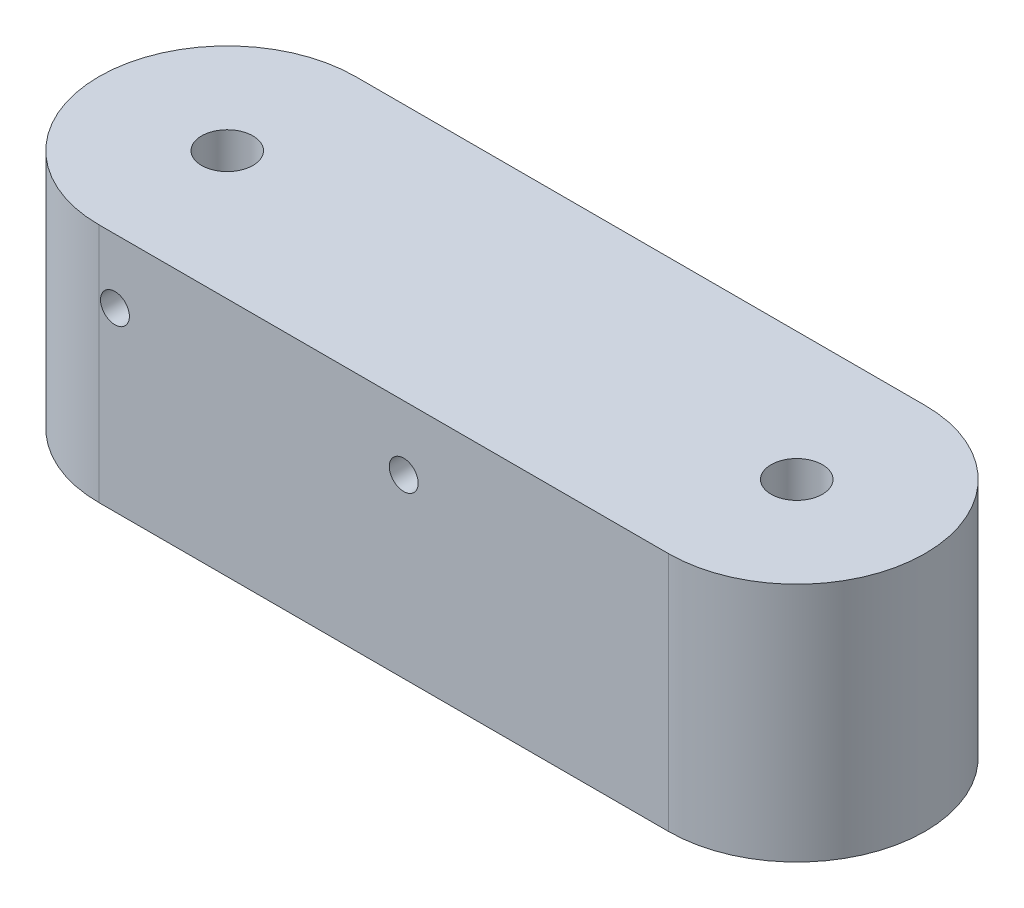
ISO-10303-21;
HEADER;
FILE_DESCRIPTION(('STEP AP214'),'2;1');
FILE_NAME('part.step','',(''),(''),'','','');
FILE_SCHEMA(('AUTOMOTIVE_DESIGN { 1 0 10303 214 1 1 1 1 }'));
ENDSEC;
DATA;
#1=APPLICATION_CONTEXT('core data for automotive mechanical design processes');
#2=APPLICATION_PROTOCOL_DEFINITION('international standard','automotive_design',2000,#1);
#3=PRODUCT_CONTEXT('',#1,'mechanical');
#4=PRODUCT('Part','Part','',(#3));
#5=PRODUCT_RELATED_PRODUCT_CATEGORY('part','',(#4));
#6=PRODUCT_DEFINITION_FORMATION('','',#4);
#7=PRODUCT_DEFINITION_CONTEXT('part definition',#1,'design');
#8=PRODUCT_DEFINITION('design','',#6,#7);
#9=PRODUCT_DEFINITION_SHAPE('','',#8);
#10=(LENGTH_UNIT() NAMED_UNIT(*) SI_UNIT(.MILLI.,.METRE.));
#11=(NAMED_UNIT(*) PLANE_ANGLE_UNIT() SI_UNIT($,.RADIAN.));
#12=(NAMED_UNIT(*) SI_UNIT($,.STERADIAN.) SOLID_ANGLE_UNIT());
#13=UNCERTAINTY_MEASURE_WITH_UNIT(LENGTH_MEASURE(1.E-05),#10,'distance_accuracy_value','');
#14=(GEOMETRIC_REPRESENTATION_CONTEXT(3) GLOBAL_UNCERTAINTY_ASSIGNED_CONTEXT((#13)) GLOBAL_UNIT_ASSIGNED_CONTEXT((#10,
#11,#12)) REPRESENTATION_CONTEXT('',''));
#15=CARTESIAN_POINT('',(0.,0.,0.));
#16=DIRECTION('',(0.,0.,1.));
#17=DIRECTION('',(1.,0.,0.));
#18=AXIS2_PLACEMENT_3D('',#15,#16,#17);
#19=CARTESIAN_POINT('',(0.,15.,8.));
#20=DIRECTION('',(0.,0.,-1.));
#21=DIRECTION('',(-1.,0.,0.));
#22=AXIS2_PLACEMENT_3D('',#19,#20,#21);
#23=PLANE('',#22);
#24=CARTESIAN_POINT('',(1.,11.,8.));
#25=DIRECTION('',(0.,0.,1.));
#26=DIRECTION('',(1.,0.,0.));
#27=AXIS2_PLACEMENT_3D('',#24,#25,#26);
#28=CIRCLE('',#27,0.9);
#29=CARTESIAN_POINT('',(1.9,11.,8.));
#30=VERTEX_POINT('',#29);
#31=EDGE_CURVE('E178',#30,#30,#28,.T.);
#32=ORIENTED_EDGE('',*,*,#31,.F.);
#33=EDGE_LOOP('',(#32));
#34=FACE_BOUND('',#33,.T.);
#35=CARTESIAN_POINT('',(19.,11.,8.));
#36=DIRECTION('',(0.,0.,1.));
#37=DIRECTION('',(1.,0.,0.));
#38=AXIS2_PLACEMENT_3D('',#35,#36,#37);
#39=CIRCLE('',#38,0.9);
#40=CARTESIAN_POINT('',(19.9,11.,8.));
#41=VERTEX_POINT('',#40);
#42=EDGE_CURVE('E173',#41,#41,#39,.T.);
#43=ORIENTED_EDGE('',*,*,#42,.F.);
#44=EDGE_LOOP('',(#43));
#45=FACE_BOUND('',#44,.T.);
#46=DIRECTION('',(1.,0.,0.));
#47=VECTOR('',#46,1.);
#48=CARTESIAN_POINT('',(0.,0.,8.));
#49=LINE('',#48,#47);
#50=CARTESIAN_POINT('',(0.,0.,8.));
#51=VERTEX_POINT('',#50);
#52=CARTESIAN_POINT('',(35.5,0.,8.));
#53=VERTEX_POINT('',#52);
#54=EDGE_CURVE('E111',#51,#53,#49,.T.);
#55=ORIENTED_EDGE('',*,*,#54,.T.);
#56=DIRECTION('',(0.,-1.,0.));
#57=VECTOR('',#56,1.);
#58=CARTESIAN_POINT('',(35.5,15.,8.));
#59=LINE('',#58,#57);
#60=CARTESIAN_POINT('',(35.5,15.,8.));
#61=VERTEX_POINT('',#60);
#62=EDGE_CURVE('E11',#61,#53,#59,.T.);
#63=ORIENTED_EDGE('',*,*,#62,.F.);
#64=DIRECTION('',(1.,0.,0.));
#65=VECTOR('',#64,1.);
#66=CARTESIAN_POINT('',(0.,15.,8.));
#67=LINE('',#66,#65);
#68=CARTESIAN_POINT('',(0.,15.,8.));
#69=VERTEX_POINT('',#68);
#70=EDGE_CURVE('E88',#69,#61,#67,.T.);
#71=ORIENTED_EDGE('',*,*,#70,.F.);
#72=DIRECTION('',(0.,-1.,0.));
#73=VECTOR('',#72,1.);
#74=CARTESIAN_POINT('',(0.,15.,8.));
#75=LINE('',#74,#73);
#76=EDGE_CURVE('E100',#69,#51,#75,.T.);
#77=ORIENTED_EDGE('',*,*,#76,.T.);
#78=EDGE_LOOP('',(#55,#63,#71,#77));
#79=FACE_BOUND('',#78,.T.);
#80=ADVANCED_FACE('F36',(#34,#45,#79),#23,.F.);
#81=CARTESIAN_POINT('',(35.5,15.,0.));
#82=DIRECTION('',(0.,-1.,0.));
#83=DIRECTION('',(0.,0.,-1.));
#84=AXIS2_PLACEMENT_3D('',#81,#82,#83);
#85=CYLINDRICAL_SURFACE('',#84,8.);
#86=CARTESIAN_POINT('',(35.5,0.,0.));
#87=DIRECTION('',(0.,1.,0.));
#88=DIRECTION('',(0.,0.,1.));
#89=AXIS2_PLACEMENT_3D('',#86,#87,#88);
#90=CIRCLE('',#89,8.);
#91=CARTESIAN_POINT('',(35.5,0.,-8.));
#92=VERTEX_POINT('',#91);
#93=EDGE_CURVE('E93',#53,#92,#90,.T.);
#94=ORIENTED_EDGE('',*,*,#93,.T.);
#95=DIRECTION('',(0.,-1.,0.));
#96=VECTOR('',#95,1.);
#97=CARTESIAN_POINT('',(35.5,15.,-8.));
#98=LINE('',#97,#96);
#99=CARTESIAN_POINT('',(35.5,15.,-8.));
#100=VERTEX_POINT('',#99);
#101=EDGE_CURVE('E49',#100,#92,#98,.T.);
#102=ORIENTED_EDGE('',*,*,#101,.F.);
#103=CARTESIAN_POINT('',(35.5,15.,0.));
#104=DIRECTION('',(0.,1.,0.));
#105=DIRECTION('',(0.,0.,1.));
#106=AXIS2_PLACEMENT_3D('',#103,#104,#105);
#107=CIRCLE('',#106,8.);
#108=EDGE_CURVE('E83',#61,#100,#107,.T.);
#109=ORIENTED_EDGE('',*,*,#108,.F.);
#110=ORIENTED_EDGE('',*,*,#62,.T.);
#111=EDGE_LOOP('',(#94,#102,#109,#110));
#112=FACE_BOUND('',#111,.T.);
#113=ADVANCED_FACE('F92',(#112),#85,.T.);
#114=CARTESIAN_POINT('',(0.,15.,-8.));
#115=DIRECTION('',(0.,0.,-1.));
#116=DIRECTION('',(-1.,0.,0.));
#117=AXIS2_PLACEMENT_3D('',#114,#115,#116);
#118=PLANE('',#117);
#119=CARTESIAN_POINT('',(1.,11.,-8.));
#120=DIRECTION('',(0.,0.,1.));
#121=DIRECTION('',(1.,0.,0.));
#122=AXIS2_PLACEMENT_3D('',#119,#120,#121);
#123=CIRCLE('',#122,0.9);
#124=CARTESIAN_POINT('',(1.9,11.,-8.));
#125=VERTEX_POINT('',#124);
#126=EDGE_CURVE('E181',#125,#125,#123,.T.);
#127=ORIENTED_EDGE('',*,*,#126,.T.);
#128=EDGE_LOOP('',(#127));
#129=FACE_BOUND('',#128,.T.);
#130=CARTESIAN_POINT('',(19.,11.,-8.));
#131=DIRECTION('',(0.,0.,1.));
#132=DIRECTION('',(1.,0.,0.));
#133=AXIS2_PLACEMENT_3D('',#130,#131,#132);
#134=CIRCLE('',#133,0.9);
#135=CARTESIAN_POINT('',(19.9,11.,-8.));
#136=VERTEX_POINT('',#135);
#137=EDGE_CURVE('E108',#136,#136,#134,.T.);
#138=ORIENTED_EDGE('',*,*,#137,.T.);
#139=EDGE_LOOP('',(#138));
#140=FACE_BOUND('',#139,.T.);
#141=DIRECTION('',(1.,0.,0.));
#142=VECTOR('',#141,1.);
#143=CARTESIAN_POINT('',(0.,0.,-8.));
#144=LINE('',#143,#142);
#145=CARTESIAN_POINT('',(0.,0.,-8.));
#146=VERTEX_POINT('',#145);
#147=EDGE_CURVE('E115',#146,#92,#144,.T.);
#148=ORIENTED_EDGE('',*,*,#147,.F.);
#149=DIRECTION('',(0.,-1.,0.));
#150=VECTOR('',#149,1.);
#151=CARTESIAN_POINT('',(0.,15.,-8.));
#152=LINE('',#151,#150);
#153=CARTESIAN_POINT('',(0.,15.,-8.));
#154=VERTEX_POINT('',#153);
#155=EDGE_CURVE('E73',#154,#146,#152,.T.);
#156=ORIENTED_EDGE('',*,*,#155,.F.);
#157=DIRECTION('',(1.,0.,0.));
#158=VECTOR('',#157,1.);
#159=CARTESIAN_POINT('',(0.,15.,-8.));
#160=LINE('',#159,#158);
#161=EDGE_CURVE('E86',#154,#100,#160,.T.);
#162=ORIENTED_EDGE('',*,*,#161,.T.);
#163=ORIENTED_EDGE('',*,*,#101,.T.);
#164=EDGE_LOOP('',(#148,#156,#162,#163));
#165=FACE_BOUND('',#164,.T.);
#166=ADVANCED_FACE('F98',(#129,#140,#165),#118,.T.);
#167=CARTESIAN_POINT('',(0.,15.,0.));
#168=DIRECTION('',(0.,-1.,0.));
#169=DIRECTION('',(0.,0.,-1.));
#170=AXIS2_PLACEMENT_3D('',#167,#168,#169);
#171=CYLINDRICAL_SURFACE('',#170,1.6);
#172=CARTESIAN_POINT('',(1.6,11.6708203932499,0.));
#173=CARTESIAN_POINT('',(1.59999962684347,11.6708215298387,-0.0382367706221882));
#174=CARTESIAN_POINT('',(1.59862562737478,11.6720582834394,-0.0764853978941076));
#175=CARTESIAN_POINT('',(1.59316036706339,11.6768843199983,-0.152648122487958));
#176=CARTESIAN_POINT('',(1.58906725648338,11.6804752043856,-0.190561974268232));
#177=CARTESIAN_POINT('',(1.5727755376725,11.6943632094809,-0.303604939608474));
#178=CARTESIAN_POINT('',(1.55656518818201,11.707772643413,-0.377798189652491));
#179=CARTESIAN_POINT('',(1.509588352196,11.7425183211236,-0.538168073439271));
#180=CARTESIAN_POINT('',(1.47639570020867,11.7649517271204,-0.623366576050245));
#181=CARTESIAN_POINT('',(1.39605226308205,11.8094797709061,-0.786967686150846));
#182=CARTESIAN_POINT('',(1.34891198150697,11.8315746505074,-0.865375350393591));
#183=CARTESIAN_POINT('',(1.25535548759118,11.864033993923,-0.994298690433262));
#184=CARTESIAN_POINT('',(1.21207225156546,11.8759554091617,-1.04669142017184));
#185=CARTESIAN_POINT('',(1.11856402616941,11.8934172720329,-1.14605449222098));
#186=CARTESIAN_POINT('',(1.06835358991481,11.8989708756053,-1.19303583307615));
#187=CARTESIAN_POINT('',(0.973917505908268,11.900571225468,-1.27057079491096));
#188=CARTESIAN_POINT('',(0.930826813838838,11.8984500320153,-1.30245891336127));
#189=CARTESIAN_POINT('',(0.842275624866825,11.8871920108813,-1.36139313801762));
#190=CARTESIAN_POINT('',(0.796816535850122,11.8780593077992,-1.3884420793932));
#191=CARTESIAN_POINT('',(0.704947608849006,11.8516115000538,-1.43727987730256));
#192=CARTESIAN_POINT('',(0.658533251135129,11.8342371006673,-1.45902885873831));
#193=CARTESIAN_POINT('',(0.56744090969834,11.7908425911451,-1.49681067623157));
#194=CARTESIAN_POINT('',(0.522762210509795,11.7648260865814,-1.51284589035632));
#195=CARTESIAN_POINT('',(0.442644547022656,11.7081483374686,-1.5380581503241));
#196=CARTESIAN_POINT('',(0.406737924674104,11.6784017080662,-1.54782240248244));
#197=CARTESIAN_POINT('',(0.339605745702485,11.6132429052696,-1.56392487661366));
#198=CARTESIAN_POINT('',(0.308380329347347,11.5778305621733,-1.57026299594052));
#199=CARTESIAN_POINT('',(0.25192625143411,11.5025781284064,-1.58030148195261));
#200=CARTESIAN_POINT('',(0.226658314089571,11.4627697325422,-1.58401946559329));
#201=CARTESIAN_POINT('',(0.182613345103557,11.379597969873,-1.5897002307657));
#202=CARTESIAN_POINT('',(0.163837320899541,11.3362340526006,-1.5916627399518));
#203=CARTESIAN_POINT('',(0.132588961698401,11.2450071091074,-1.59457833279903));
#204=CARTESIAN_POINT('',(0.120447912349497,11.1970287830247,-1.59548059526692));
#205=CARTESIAN_POINT('',(0.104182074454982,11.0997224873803,-1.59662550755658));
#206=CARTESIAN_POINT('',(0.100058360282229,11.050394337832,-1.59686806897604));
#207=CARTESIAN_POINT('',(0.099941646755732,10.9506649155088,-1.59687581980954));
#208=CARTESIAN_POINT('',(0.104125051781329,10.9002633332123,-1.59663065193071));
#209=CARTESIAN_POINT('',(0.120859566498755,10.8008714886406,-1.59545047545677));
#210=CARTESIAN_POINT('',(0.133411553372504,10.751881374875,-1.59451539454494));
#211=CARTESIAN_POINT('',(0.166527640076639,10.6566854043285,-1.59139679478371));
#212=CARTESIAN_POINT('',(0.187097454987833,10.6104815607788,-1.58921238489666));
#213=CARTESIAN_POINT('',(0.235600447728154,10.5222710152434,-1.58274702312861));
#214=CARTESIAN_POINT('',(0.263532502313213,10.4802636743516,-1.57846639097917));
#215=CARTESIAN_POINT('',(0.325120196448419,10.4025524141342,-1.56692524872233));
#216=CARTESIAN_POINT('',(0.358645769468854,10.3667362661818,-1.55972808176458));
#217=CARTESIAN_POINT('',(0.4304603544896,10.3014469207054,-1.54145097316074));
#218=CARTESIAN_POINT('',(0.468746835384926,10.2719703753345,-1.53037308902757));
#219=CARTESIAN_POINT('',(0.546525109526954,10.2212730464474,-1.50429771298245));
#220=CARTESIAN_POINT('',(0.585877919344107,10.1997319304908,-1.48950659326433));
#221=CARTESIAN_POINT('',(0.665725236167041,10.1632273960332,-1.45557227571701));
#222=CARTESIAN_POINT('',(0.706219746287058,10.1482639954761,-1.43642906601553));
#223=CARTESIAN_POINT('',(0.786994582296643,10.1245509115286,-1.39382021968888));
#224=CARTESIAN_POINT('',(0.827272861124608,10.1158322971358,-1.37033369219213));
#225=CARTESIAN_POINT('',(0.906159595324121,10.1040155327939,-1.31950123304457));
#226=CARTESIAN_POINT('',(0.944767256037466,10.1009200294996,-1.29215349054143));
#227=CARTESIAN_POINT('',(1.03596185237647,10.0991074925267,-1.22123911480687));
#228=CARTESIAN_POINT('',(1.08718221553961,10.1029315037186,-1.17584762775491));
#229=CARTESIAN_POINT('',(1.182970862788,10.1174569178784,-1.07945836970671));
#230=CARTESIAN_POINT('',(1.22752201454919,10.1281756710721,-1.02844672503581));
#231=CARTESIAN_POINT('',(1.32371378912656,10.1582429688265,-0.903326166757641));
#232=CARTESIAN_POINT('',(1.37240451252404,10.1792976480007,-0.827368403506401));
#233=CARTESIAN_POINT('',(1.45633908400145,10.2228337577299,-0.668696334976219));
#234=CARTESIAN_POINT('',(1.49156989481332,10.2453165470996,-0.585975572708409));
#235=CARTESIAN_POINT('',(1.54254464390852,10.2813710769456,-0.431105972864925));
#236=CARTESIAN_POINT('',(1.56073142380903,10.2958249384138,-0.359977137754118));
#237=CARTESIAN_POINT('',(1.58718635005225,10.3177102464557,-0.215013208174489));
#238=CARTESIAN_POINT('',(1.59549260630546,10.3251686513081,-0.141189651279631));
#239=CARTESIAN_POINT('',(1.60172248268915,10.330704818939,0.0077140319909708));
#240=CARTESIAN_POINT('',(1.59958656583268,10.3287287919559,0.0827989256902288));
#241=CARTESIAN_POINT('',(1.58495885471823,10.3159660567192,0.231319889556274));
#242=CARTESIAN_POINT('',(1.57243486038339,10.305151954486,0.304750102797873));
#243=CARTESIAN_POINT('',(1.53386716023036,10.2749481945065,0.464122987822272));
#244=CARTESIAN_POINT('',(1.50543167451138,10.2541841090173,0.549205117463522));
#245=CARTESIAN_POINT('',(1.43504739827312,10.2110523540594,0.713166789282845));
#246=CARTESIAN_POINT('',(1.39308831111672,10.1886834728479,0.792041548160495));
#247=CARTESIAN_POINT('',(1.3053547179085,10.15231784888,0.928047122516887));
#248=CARTESIAN_POINT('',(1.26186914629349,10.1375383717671,0.98644100843057));
#249=CARTESIAN_POINT('',(1.16663165004645,10.114209039977,1.09739776196576));
#250=CARTESIAN_POINT('',(1.11490091487929,10.1056435209551,1.14997500649304));
#251=CARTESIAN_POINT('',(1.01841472155733,10.0992439033205,1.23525432410981));
#252=CARTESIAN_POINT('',(0.975264937900579,10.0992235467584,1.26959833432027));
#253=CARTESIAN_POINT('',(0.885981942056091,10.1061323160679,1.33343068245022));
#254=CARTESIAN_POINT('',(0.839850396730418,10.1130575901,1.36292170114177));
#255=CARTESIAN_POINT('',(0.745888056611981,10.1352610829847,1.41654474376356));
#256=CARTESIAN_POINT('',(0.698046162726069,10.1506096978722,1.44062915926268));
#257=CARTESIAN_POINT('',(0.603490301397811,10.1904301763126,1.48272556345177));
#258=CARTESIAN_POINT('',(0.556775604597188,10.2148959623024,1.50074158217523));
#259=CARTESIAN_POINT('',(0.473122838162425,10.2688747217056,1.52900188746492));
#260=CARTESIAN_POINT('',(0.435709908647787,10.2972876108673,1.53996010330285));
#261=CARTESIAN_POINT('',(0.365318145883253,10.36015279122,1.55816094996024));
#262=CARTESIAN_POINT('',(0.332339366919428,10.3946051563388,1.56540353529331));
#263=CARTESIAN_POINT('',(0.27279088768849,10.4677043936931,1.57685961780745));
#264=CARTESIAN_POINT('',(0.246088026228726,10.5062327571097,1.58114071985234));
#265=CARTESIAN_POINT('',(0.19893883117278,10.5870928106807,1.58776304928504));
#266=CARTESIAN_POINT('',(0.178493312492728,10.6294249952925,1.5901040240709));
#267=CARTESIAN_POINT('',(0.143651325715917,10.7188035959237,1.5936396314303));
#268=CARTESIAN_POINT('',(0.129574746353467,10.7659771212916,1.59477685875872));
#269=CARTESIAN_POINT('',(0.109289506369583,10.8620001912879,1.5962956680494));
#270=CARTESIAN_POINT('',(0.103082023757302,10.9108499857311,1.5966771368789));
#271=CARTESIAN_POINT('',(0.0986512210267945,11.0101676230027,1.59695774414078));
#272=CARTESIAN_POINT('',(0.100635957205257,11.0606449167806,1.5968443094827));
#273=CARTESIAN_POINT('',(0.113007730354863,11.1605588921359,1.59601590940314));
#274=CARTESIAN_POINT('',(0.123395643072351,11.2099954647023,1.59530088128562));
#275=CARTESIAN_POINT('',(0.152309838744735,11.3065395566071,1.59279988279265));
#276=CARTESIAN_POINT('',(0.170856370880784,11.3536409544705,1.59101124373055));
#277=CARTESIAN_POINT('',(0.215521672913217,11.4439956687334,1.58557686452165));
#278=CARTESIAN_POINT('',(0.241639794165369,11.4872493143481,1.58193128343544));
#279=CARTESIAN_POINT('',(0.300060613077581,11.5679108688519,1.57188561336954));
#280=CARTESIAN_POINT('',(0.332253850816543,11.6054036469434,1.56553209019082));
#281=CARTESIAN_POINT('',(0.401840225317914,11.674237785197,1.54912774562864));
#282=CARTESIAN_POINT('',(0.439230593798613,11.7055823989231,1.53907888792773));
#283=CARTESIAN_POINT('',(0.515775369638196,11.7600206104155,1.5150932369582));
#284=CARTESIAN_POINT('',(0.554770631050062,11.7834262735253,1.50135551721509));
#285=CARTESIAN_POINT('',(0.634350426585784,11.8235819230749,1.46950144934417));
#286=CARTESIAN_POINT('',(0.67493481414635,11.8403325217228,1.45138550422174));
#287=CARTESIAN_POINT('',(0.755751741672415,11.8672629451772,1.4109799689872));
#288=CARTESIAN_POINT('',(0.795984584612453,11.8774923718827,1.38872359009466));
#289=CARTESIAN_POINT('',(0.875094806130009,11.8922000411481,1.34028606096767));
#290=CARTESIAN_POINT('',(0.913971532370873,11.8966755520117,1.31410305313107));
#291=CARTESIAN_POINT('',(1.00464030167961,11.9015479368575,1.24700616529641));
#292=CARTESIAN_POINT('',(1.05531641663833,11.8995713916614,1.2044104787496));
#293=CARTESIAN_POINT('',(1.15064398757026,11.8886065525359,1.11372213412283));
#294=CARTESIAN_POINT('',(1.19528162700878,11.8796024871336,1.06561731967595));
#295=CARTESIAN_POINT('',(1.29297997985074,11.8529803311259,0.946624831913538));
#296=CARTESIAN_POINT('',(1.34317252637225,11.8334180482383,0.873828004969812));
#297=CARTESIAN_POINT('',(1.43078201707031,11.7916955975243,0.721532853040347));
#298=CARTESIAN_POINT('',(1.46817773376655,11.7695311942757,0.642023663236661));
#299=CARTESIAN_POINT('',(1.52519468696021,11.7315488399437,0.489298078157636));
#300=CARTESIAN_POINT('',(1.54661884933925,11.7152768666064,0.416870136295665));
#301=CARTESIAN_POINT('',(1.57907260474008,11.6892937328196,0.268734248102609));
#302=CARTESIAN_POINT('',(1.59014910121462,11.6795530250398,0.193042745198399));
#303=CARTESIAN_POINT('',(1.59715591495603,11.6733536941447,0.0973389529140138));
#304=CARTESIAN_POINT('',(1.59822132043807,11.6724072362682,0.0779016187646855));
#305=CARTESIAN_POINT('',(1.59964348862798,11.6711402691502,0.0389772193607292));
#306=CARTESIAN_POINT('',(1.60000019020635,11.6708198139048,0.0194901499613151));
#307=CARTESIAN_POINT('',(1.6,11.6708203932499,0.));
#308=B_SPLINE_CURVE_WITH_KNOTS('',3,(#172,#173,#174,#175,#176,#177,#178,#179,#180,#181,#182,
#183,#184,#185,#186,#187,#188,#189,#190,#191,#192,#193,#194,#195,#196,#197,#198,#199,#200,#201,
#202,#203,#204,#205,#206,#207,#208,#209,#210,#211,#212,#213,#214,#215,#216,#217,#218,#219,#220,
#221,#222,#223,#224,#225,#226,#227,#228,#229,#230,#231,#232,#233,#234,#235,#236,#237,#238,#239,
#240,#241,#242,#243,#244,#245,#246,#247,#248,#249,#250,#251,#252,#253,#254,#255,#256,#257,#258,
#259,#260,#261,#262,#263,#264,#265,#266,#267,#268,#269,#270,#271,#272,#273,#274,#275,#276,#277,
#278,#279,#280,#281,#282,#283,#284,#285,#286,#287,#288,#289,#290,#291,#292,#293,#294,#295,#296,
#297,#298,#299,#300,#301,#302,#303,#304,#305,#306,#307),.UNSPECIFIED.,.T.,.F.,(4,2,2,2,2,2,2,2,
2,2,2,2,2,2,2,2,2,2,2,2,2,2,2,2,2,2,2,2,2,2,2,2,2,2,2,2,2,2,2,2,2,2,2,2,2,2,2,2,2,2,2,2,2,2,2,2,
2,2,2,2,2,2,2,2,2,2,2,4),(0.,0.114685464256671,0.22944902591512,0.459677166899916,
0.740816539229172,1.02174473001969,1.22806006562649,1.43394838000297,1.59426855133049,
1.75449448471378,1.91589106020427,2.07722038383992,2.21944885302189,2.36168158309453,
2.50294861824115,2.64423756586433,2.7920536921765,2.9398896254055,3.09089847612906,
3.24192315785787,3.39305568691061,3.54416517127038,3.69215504363904,3.84006657188498,
3.98109551464353,4.12212484212642,4.26385103347719,4.40564391445804,4.61012940369279,
4.81513149285983,5.09166009448752,5.36845586666045,5.59210170726877,5.81488210296978,
6.0389341774707,6.26368335627346,6.53854281972934,6.81361205278188,7.03573569464294,
7.25729743580104,7.42212665517342,7.58686451569523,7.75300057472923,7.91902608396287,
8.06302723999334,8.2070301588294,8.3476264507493,8.48824104524313,8.63529498726027,
8.7823709407542,8.93320483872904,9.08405445805094,9.23528060783308,9.38649380617324,
9.53520546944567,9.68383822199878,9.82566584516601,9.96748041840218,10.1082030175524,
10.2489924007212,10.4465723796162,10.6445970557898,10.9148658090493,11.1855807373003,
11.4165738751843,11.6465148235085,11.7049675663595,11.7634253508526),.UNSPECIFIED.);
#309=CARTESIAN_POINT('',(1.6,11.6708203932499,0.));
#310=VERTEX_POINT('',#309);
#311=EDGE_CURVE('E40',#310,#310,#308,.T.);
#312=ORIENTED_EDGE('',*,*,#311,.F.);
#313=EDGE_LOOP('',(#312));
#314=FACE_BOUND('',#313,.T.);
#315=CARTESIAN_POINT('',(0.,15.,0.));
#316=DIRECTION('',(0.,1.,0.));
#317=DIRECTION('',(0.,0.,1.));
#318=AXIS2_PLACEMENT_3D('',#315,#316,#317);
#319=CIRCLE('',#318,1.6);
#320=CARTESIAN_POINT('',(0.,15.,1.6));
#321=VERTEX_POINT('',#320);
#322=EDGE_CURVE('E166',#321,#321,#319,.T.);
#323=ORIENTED_EDGE('',*,*,#322,.T.);
#324=EDGE_LOOP('',(#323));
#325=FACE_BOUND('',#324,.T.);
#326=CARTESIAN_POINT('',(0.,0.,0.));
#327=DIRECTION('',(0.,1.,0.));
#328=DIRECTION('',(0.,0.,1.));
#329=AXIS2_PLACEMENT_3D('',#326,#327,#328);
#330=CIRCLE('',#329,1.6);
#331=CARTESIAN_POINT('',(0.,0.,1.6));
#332=VERTEX_POINT('',#331);
#333=EDGE_CURVE('E107',#332,#332,#330,.T.);
#334=ORIENTED_EDGE('',*,*,#333,.F.);
#335=EDGE_LOOP('',(#334));
#336=FACE_BOUND('',#335,.T.);
#337=ADVANCED_FACE('F150',(#314,#325,#336),#171,.F.);
#338=CARTESIAN_POINT('',(35.5,15.,0.));
#339=DIRECTION('',(0.,-1.,0.));
#340=DIRECTION('',(0.,0.,-1.));
#341=AXIS2_PLACEMENT_3D('',#338,#339,#340);
#342=CYLINDRICAL_SURFACE('',#341,1.6);
#343=CARTESIAN_POINT('',(35.5,15.,0.));
#344=DIRECTION('',(0.,1.,0.));
#345=DIRECTION('',(0.,0.,1.));
#346=AXIS2_PLACEMENT_3D('',#343,#344,#345);
#347=CIRCLE('',#346,1.6);
#348=CARTESIAN_POINT('',(35.5,15.,1.6));
#349=VERTEX_POINT('',#348);
#350=EDGE_CURVE('E118',#349,#349,#347,.T.);
#351=ORIENTED_EDGE('',*,*,#350,.T.);
#352=EDGE_LOOP('',(#351));
#353=FACE_BOUND('',#352,.T.);
#354=CARTESIAN_POINT('',(35.5,0.,0.));
#355=DIRECTION('',(0.,1.,0.));
#356=DIRECTION('',(0.,0.,1.));
#357=AXIS2_PLACEMENT_3D('',#354,#355,#356);
#358=CIRCLE('',#357,1.6);
#359=CARTESIAN_POINT('',(35.5,0.,1.6));
#360=VERTEX_POINT('',#359);
#361=EDGE_CURVE('E104',#360,#360,#358,.T.);
#362=ORIENTED_EDGE('',*,*,#361,.F.);
#363=EDGE_LOOP('',(#362));
#364=FACE_BOUND('',#363,.T.);
#365=ADVANCED_FACE('F38',(#353,#364),#342,.F.);
#366=CARTESIAN_POINT('',(0.,15.,0.));
#367=DIRECTION('',(0.,-1.,0.));
#368=DIRECTION('',(0.,0.,-1.));
#369=AXIS2_PLACEMENT_3D('',#366,#367,#368);
#370=CYLINDRICAL_SURFACE('',#369,8.);
#371=CARTESIAN_POINT('',(0.,0.,0.));
#372=DIRECTION('',(0.,1.,0.));
#373=DIRECTION('',(0.,0.,1.));
#374=AXIS2_PLACEMENT_3D('',#371,#372,#373);
#375=CIRCLE('',#374,8.);
#376=EDGE_CURVE('E76',#146,#51,#375,.T.);
#377=ORIENTED_EDGE('',*,*,#376,.T.);
#378=ORIENTED_EDGE('',*,*,#76,.F.);
#379=CARTESIAN_POINT('',(0.,15.,0.));
#380=DIRECTION('',(0.,1.,0.));
#381=DIRECTION('',(0.,0.,1.));
#382=AXIS2_PLACEMENT_3D('',#379,#380,#381);
#383=CIRCLE('',#382,8.);
#384=EDGE_CURVE('E57',#154,#69,#383,.T.);
#385=ORIENTED_EDGE('',*,*,#384,.F.);
#386=ORIENTED_EDGE('',*,*,#155,.T.);
#387=EDGE_LOOP('',(#377,#378,#385,#386));
#388=FACE_BOUND('',#387,.T.);
#389=ADVANCED_FACE('F135',(#388),#370,.T.);
#390=CARTESIAN_POINT('',(0.,15.,0.));
#391=DIRECTION('',(0.,1.,0.));
#392=DIRECTION('',(0.,0.,1.));
#393=AXIS2_PLACEMENT_3D('',#390,#391,#392);
#394=PLANE('',#393);
#395=ORIENTED_EDGE('',*,*,#350,.F.);
#396=EDGE_LOOP('',(#395));
#397=FACE_BOUND('',#396,.T.);
#398=ORIENTED_EDGE('',*,*,#322,.F.);
#399=EDGE_LOOP('',(#398));
#400=FACE_BOUND('',#399,.T.);
#401=ORIENTED_EDGE('',*,*,#70,.T.);
#402=ORIENTED_EDGE('',*,*,#108,.T.);
#403=ORIENTED_EDGE('',*,*,#161,.F.);
#404=ORIENTED_EDGE('',*,*,#384,.T.);
#405=EDGE_LOOP('',(#401,#402,#403,#404));
#406=FACE_BOUND('',#405,.T.);
#407=ADVANCED_FACE('F84',(#397,#400,#406),#394,.T.);
#408=CARTESIAN_POINT('',(0.,0.,0.));
#409=DIRECTION('',(0.,1.,0.));
#410=DIRECTION('',(0.,0.,1.));
#411=AXIS2_PLACEMENT_3D('',#408,#409,#410);
#412=PLANE('',#411);
#413=ORIENTED_EDGE('',*,*,#361,.T.);
#414=EDGE_LOOP('',(#413));
#415=FACE_BOUND('',#414,.T.);
#416=ORIENTED_EDGE('',*,*,#333,.T.);
#417=EDGE_LOOP('',(#416));
#418=FACE_BOUND('',#417,.T.);
#419=ORIENTED_EDGE('',*,*,#54,.F.);
#420=ORIENTED_EDGE('',*,*,#376,.F.);
#421=ORIENTED_EDGE('',*,*,#147,.T.);
#422=ORIENTED_EDGE('',*,*,#93,.F.);
#423=EDGE_LOOP('',(#419,#420,#421,#422));
#424=FACE_BOUND('',#423,.T.);
#425=ADVANCED_FACE('F123',(#415,#418,#424),#412,.F.);
#426=CARTESIAN_POINT('',(19.,11.,-8.));
#427=DIRECTION('',(0.,0.,1.));
#428=DIRECTION('',(1.,0.,0.));
#429=AXIS2_PLACEMENT_3D('',#426,#427,#428);
#430=CYLINDRICAL_SURFACE('',#429,0.9);
#431=ORIENTED_EDGE('',*,*,#137,.F.);
#432=EDGE_LOOP('',(#431));
#433=FACE_BOUND('',#432,.T.);
#434=ORIENTED_EDGE('',*,*,#42,.T.);
#435=EDGE_LOOP('',(#434));
#436=FACE_BOUND('',#435,.T.);
#437=ADVANCED_FACE('F125',(#433,#436),#430,.F.);
#438=CARTESIAN_POINT('',(1.,11.,-8.));
#439=DIRECTION('',(0.,0.,1.));
#440=DIRECTION('',(1.,0.,0.));
#441=AXIS2_PLACEMENT_3D('',#438,#439,#440);
#442=CYLINDRICAL_SURFACE('',#441,0.9);
#443=ORIENTED_EDGE('',*,*,#311,.T.);
#444=EDGE_LOOP('',(#443));
#445=FACE_BOUND('',#444,.T.);
#446=ORIENTED_EDGE('',*,*,#126,.F.);
#447=EDGE_LOOP('',(#446));
#448=FACE_BOUND('',#447,.T.);
#449=ORIENTED_EDGE('',*,*,#31,.T.);
#450=EDGE_LOOP('',(#449));
#451=FACE_BOUND('',#450,.T.);
#452=ADVANCED_FACE('F132',(#445,#448,#451),#442,.F.);
#453=CLOSED_SHELL('',(#80,#113,#166,#337,#365,#389,#407,#425,#437,#452));
#454=MANIFOLD_SOLID_BREP('B2',#453);
#455=ADVANCED_BREP_SHAPE_REPRESENTATION('',(#18,#454),#14);
#456=SHAPE_DEFINITION_REPRESENTATION(#9,#455);
ENDSEC;
END-ISO-10303-21;
